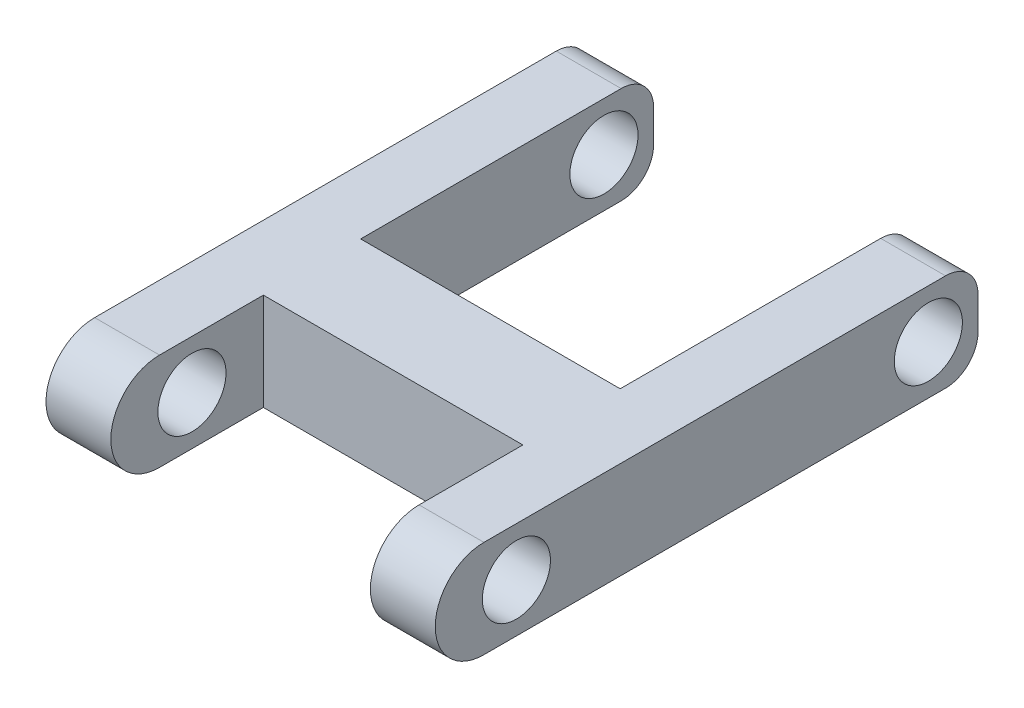
ISO-10303-21;
HEADER;
FILE_DESCRIPTION(('STEP AP214'),'2;1');
FILE_NAME('part.step','',(''),(''),'','','');
FILE_SCHEMA(('AUTOMOTIVE_DESIGN { 1 0 10303 214 1 1 1 1 }'));
ENDSEC;
DATA;
#1=APPLICATION_CONTEXT('core data for automotive mechanical design processes');
#2=APPLICATION_PROTOCOL_DEFINITION('international standard','automotive_design',2000,#1);
#3=PRODUCT_CONTEXT('',#1,'mechanical');
#4=PRODUCT('Part','Part','',(#3));
#5=PRODUCT_RELATED_PRODUCT_CATEGORY('part','',(#4));
#6=PRODUCT_DEFINITION_FORMATION('','',#4);
#7=PRODUCT_DEFINITION_CONTEXT('part definition',#1,'design');
#8=PRODUCT_DEFINITION('design','',#6,#7);
#9=PRODUCT_DEFINITION_SHAPE('','',#8);
#10=(LENGTH_UNIT() NAMED_UNIT(*) SI_UNIT(.MILLI.,.METRE.));
#11=(NAMED_UNIT(*) PLANE_ANGLE_UNIT() SI_UNIT($,.RADIAN.));
#12=(NAMED_UNIT(*) SI_UNIT($,.STERADIAN.) SOLID_ANGLE_UNIT());
#13=UNCERTAINTY_MEASURE_WITH_UNIT(LENGTH_MEASURE(1.E-05),#10,'distance_accuracy_value','');
#14=(GEOMETRIC_REPRESENTATION_CONTEXT(3) GLOBAL_UNCERTAINTY_ASSIGNED_CONTEXT((#13)) GLOBAL_UNIT_ASSIGNED_CONTEXT((#10,
#11,#12)) REPRESENTATION_CONTEXT('',''));
#15=CARTESIAN_POINT('',(0.,0.,0.));
#16=DIRECTION('',(0.,0.,1.));
#17=DIRECTION('',(1.,0.,0.));
#18=AXIS2_PLACEMENT_3D('',#15,#16,#17);
#19=CARTESIAN_POINT('',(-6.,1.5,-7.5));
#20=DIRECTION('',(1.,0.,0.));
#21=DIRECTION('',(0.,0.,-1.));
#22=AXIS2_PLACEMENT_3D('',#19,#20,#21);
#23=CYLINDRICAL_SURFACE('',#22,1.05);
#24=CARTESIAN_POINT('',(6.,1.5,-7.5));
#25=DIRECTION('',(1.,0.,0.));
#26=DIRECTION('',(0.,0.,-1.));
#27=AXIS2_PLACEMENT_3D('',#24,#25,#26);
#28=CIRCLE('',#27,1.05);
#29=CARTESIAN_POINT('',(6.,1.5,-8.55));
#30=VERTEX_POINT('',#29);
#31=EDGE_CURVE('E191',#30,#30,#28,.T.);
#32=ORIENTED_EDGE('',*,*,#31,.T.);
#33=EDGE_LOOP('',(#32));
#34=FACE_BOUND('',#33,.T.);
#35=CARTESIAN_POINT('',(4.,1.5,-7.5));
#36=DIRECTION('',(1.,0.,0.));
#37=DIRECTION('',(0.,0.,-1.));
#38=AXIS2_PLACEMENT_3D('',#35,#36,#37);
#39=CIRCLE('',#38,1.05);
#40=CARTESIAN_POINT('',(4.,1.5,-8.55));
#41=VERTEX_POINT('',#40);
#42=EDGE_CURVE('E257',#41,#41,#39,.F.);
#43=ORIENTED_EDGE('',*,*,#42,.T.);
#44=EDGE_LOOP('',(#43));
#45=FACE_BOUND('',#44,.T.);
#46=ADVANCED_FACE('F35',(#34,#45),#23,.F.);
#47=CARTESIAN_POINT('',(-4.,3.,8.7));
#48=DIRECTION('',(-1.,0.,0.));
#49=DIRECTION('',(0.,0.,1.));
#50=AXIS2_PLACEMENT_3D('',#47,#48,#49);
#51=PLANE('',#50);
#52=CARTESIAN_POINT('',(-4.,1.5,5.2));
#53=DIRECTION('',(-1.,0.,0.));
#54=DIRECTION('',(0.,0.,1.));
#55=AXIS2_PLACEMENT_3D('',#52,#53,#54);
#56=CIRCLE('',#55,1.05);
#57=CARTESIAN_POINT('',(-4.,1.5,6.25));
#58=VERTEX_POINT('',#57);
#59=EDGE_CURVE('E208',#58,#58,#56,.T.);
#60=ORIENTED_EDGE('',*,*,#59,.T.);
#61=EDGE_LOOP('',(#60));
#62=FACE_BOUND('',#61,.T.);
#63=CARTESIAN_POINT('',(-4.,1.5,6.2));
#64=DIRECTION('',(-1.,0.,0.));
#65=DIRECTION('',(0.,0.,1.));
#66=AXIS2_PLACEMENT_3D('',#63,#64,#65);
#67=CIRCLE('',#66,1.5);
#68=CARTESIAN_POINT('',(-4.,0.,6.2));
#69=VERTEX_POINT('',#68);
#70=CARTESIAN_POINT('',(-4.,3.,6.2));
#71=VERTEX_POINT('',#70);
#72=EDGE_CURVE('E224',#69,#71,#67,.T.);
#73=ORIENTED_EDGE('',*,*,#72,.F.);
#74=DIRECTION('',(0.,0.,-1.));
#75=VECTOR('',#74,1.);
#76=CARTESIAN_POINT('',(-4.,0.,8.7));
#77=LINE('',#76,#75);
#78=CARTESIAN_POINT('',(-4.,0.,3.));
#79=VERTEX_POINT('',#78);
#80=EDGE_CURVE('E226',#69,#79,#77,.T.);
#81=ORIENTED_EDGE('',*,*,#80,.T.);
#82=DIRECTION('',(0.,-1.,0.));
#83=VECTOR('',#82,1.);
#84=CARTESIAN_POINT('',(-4.,3.,3.));
#85=LINE('',#84,#83);
#86=CARTESIAN_POINT('',(-4.,3.,3.));
#87=VERTEX_POINT('',#86);
#88=EDGE_CURVE('E251',#87,#79,#85,.T.);
#89=ORIENTED_EDGE('',*,*,#88,.F.);
#90=DIRECTION('',(0.,0.,-1.));
#91=VECTOR('',#90,1.);
#92=CARTESIAN_POINT('',(-4.,3.,8.7));
#93=LINE('',#92,#91);
#94=EDGE_CURVE('E227',#71,#87,#93,.T.);
#95=ORIENTED_EDGE('',*,*,#94,.F.);
#96=EDGE_LOOP('',(#73,#81,#89,#95));
#97=FACE_BOUND('',#96,.T.);
#98=ADVANCED_FACE('F319',(#62,#97),#51,.F.);
#99=CARTESIAN_POINT('',(4.,3.,3.));
#100=DIRECTION('',(1.,0.,0.));
#101=DIRECTION('',(0.,0.,-1.));
#102=AXIS2_PLACEMENT_3D('',#99,#100,#101);
#103=PLANE('',#102);
#104=CARTESIAN_POINT('',(4.,1.5,5.2));
#105=DIRECTION('',(1.,0.,0.));
#106=DIRECTION('',(0.,0.,-1.));
#107=AXIS2_PLACEMENT_3D('',#104,#105,#106);
#108=CIRCLE('',#107,1.05);
#109=CARTESIAN_POINT('',(4.,1.5,4.15));
#110=VERTEX_POINT('',#109);
#111=EDGE_CURVE('E203',#110,#110,#108,.T.);
#112=ORIENTED_EDGE('',*,*,#111,.T.);
#113=EDGE_LOOP('',(#112));
#114=FACE_BOUND('',#113,.T.);
#115=CARTESIAN_POINT('',(4.,1.5,6.2));
#116=DIRECTION('',(1.,0.,0.));
#117=DIRECTION('',(0.,0.,-1.));
#118=AXIS2_PLACEMENT_3D('',#115,#116,#117);
#119=CIRCLE('',#118,1.5);
#120=CARTESIAN_POINT('',(4.,3.,6.2));
#121=VERTEX_POINT('',#120);
#122=CARTESIAN_POINT('',(4.,0.,6.2));
#123=VERTEX_POINT('',#122);
#124=EDGE_CURVE('E220',#121,#123,#119,.T.);
#125=ORIENTED_EDGE('',*,*,#124,.F.);
#126=DIRECTION('',(0.,0.,1.));
#127=VECTOR('',#126,1.);
#128=CARTESIAN_POINT('',(4.,3.,3.));
#129=LINE('',#128,#127);
#130=CARTESIAN_POINT('',(4.,3.,3.));
#131=VERTEX_POINT('',#130);
#132=EDGE_CURVE('E232',#131,#121,#129,.T.);
#133=ORIENTED_EDGE('',*,*,#132,.F.);
#134=DIRECTION('',(0.,-1.,0.));
#135=VECTOR('',#134,1.);
#136=CARTESIAN_POINT('',(4.,3.,3.));
#137=LINE('',#136,#135);
#138=CARTESIAN_POINT('',(4.,0.,3.));
#139=VERTEX_POINT('',#138);
#140=EDGE_CURVE('E239',#131,#139,#137,.T.);
#141=ORIENTED_EDGE('',*,*,#140,.T.);
#142=DIRECTION('',(0.,0.,1.));
#143=VECTOR('',#142,1.);
#144=CARTESIAN_POINT('',(4.,0.,3.));
#145=LINE('',#144,#143);
#146=EDGE_CURVE('E243',#139,#123,#145,.T.);
#147=ORIENTED_EDGE('',*,*,#146,.T.);
#148=EDGE_LOOP('',(#125,#133,#141,#147));
#149=FACE_BOUND('',#148,.T.);
#150=ADVANCED_FACE('F326',(#114,#149),#103,.F.);
#151=CARTESIAN_POINT('',(6.,3.,8.7));
#152=DIRECTION('',(-1.,0.,0.));
#153=DIRECTION('',(0.,0.,1.));
#154=AXIS2_PLACEMENT_3D('',#151,#152,#153);
#155=PLANE('',#154);
#156=CARTESIAN_POINT('',(6.,1.5,5.2));
#157=DIRECTION('',(-1.,0.,0.));
#158=DIRECTION('',(0.,0.,1.));
#159=AXIS2_PLACEMENT_3D('',#156,#157,#158);
#160=CIRCLE('',#159,1.05);
#161=CARTESIAN_POINT('',(6.,1.5,6.25));
#162=VERTEX_POINT('',#161);
#163=EDGE_CURVE('E200',#162,#162,#160,.T.);
#164=ORIENTED_EDGE('',*,*,#163,.T.);
#165=EDGE_LOOP('',(#164));
#166=FACE_BOUND('',#165,.T.);
#167=DIRECTION('',(0.,0.,-1.));
#168=VECTOR('',#167,1.);
#169=CARTESIAN_POINT('',(6.,0.,8.7));
#170=LINE('',#169,#168);
#171=CARTESIAN_POINT('',(6.00000000000001,0.,6.2));
#172=VERTEX_POINT('',#171);
#173=CARTESIAN_POINT('',(6.,0.,-8.03021981462437));
#174=VERTEX_POINT('',#173);
#175=EDGE_CURVE('E246',#172,#174,#170,.T.);
#176=ORIENTED_EDGE('',*,*,#175,.T.);
#177=CARTESIAN_POINT('',(6.,1.,-8.03021981462437));
#178=DIRECTION('',(-1.,0.,0.));
#179=DIRECTION('',(0.,0.,1.));
#180=AXIS2_PLACEMENT_3D('',#177,#178,#179);
#181=CIRCLE('',#180,1.);
#182=CARTESIAN_POINT('',(6.,1.,-9.03021981462437));
#183=VERTEX_POINT('',#182);
#184=EDGE_CURVE('E276',#174,#183,#181,.F.);
#185=ORIENTED_EDGE('',*,*,#184,.T.);
#186=DIRECTION('',(0.,-1.,0.));
#187=VECTOR('',#186,1.);
#188=CARTESIAN_POINT('',(6.,3.,-9.03021981462437));
#189=LINE('',#188,#187);
#190=CARTESIAN_POINT('',(6.,2.,-9.03021981462437));
#191=VERTEX_POINT('',#190);
#192=EDGE_CURVE('E178',#191,#183,#189,.T.);
#193=ORIENTED_EDGE('',*,*,#192,.F.);
#194=CARTESIAN_POINT('',(6.,2.,-8.03021981462437));
#195=DIRECTION('',(-1.,0.,0.));
#196=DIRECTION('',(0.,0.,1.));
#197=AXIS2_PLACEMENT_3D('',#194,#195,#196);
#198=CIRCLE('',#197,1.);
#199=CARTESIAN_POINT('',(6.,3.,-8.03021981462437));
#200=VERTEX_POINT('',#199);
#201=EDGE_CURVE('E278',#191,#200,#198,.F.);
#202=ORIENTED_EDGE('',*,*,#201,.T.);
#203=DIRECTION('',(0.,0.,-1.));
#204=VECTOR('',#203,1.);
#205=CARTESIAN_POINT('',(6.,3.,8.7));
#206=LINE('',#205,#204);
#207=CARTESIAN_POINT('',(6.00000000000001,3.,6.2));
#208=VERTEX_POINT('',#207);
#209=EDGE_CURVE('E235',#208,#200,#206,.T.);
#210=ORIENTED_EDGE('',*,*,#209,.F.);
#211=CARTESIAN_POINT('',(6.00000000000001,1.5,6.2));
#212=DIRECTION('',(-1.,0.,0.));
#213=DIRECTION('',(0.,0.,1.));
#214=AXIS2_PLACEMENT_3D('',#211,#212,#213);
#215=CIRCLE('',#214,1.5);
#216=EDGE_CURVE('E212',#172,#208,#215,.T.);
#217=ORIENTED_EDGE('',*,*,#216,.F.);
#218=EDGE_LOOP('',(#176,#185,#193,#202,#210,#217));
#219=FACE_BOUND('',#218,.T.);
#220=ORIENTED_EDGE('',*,*,#31,.F.);
#221=EDGE_LOOP('',(#220));
#222=FACE_BOUND('',#221,.T.);
#223=ADVANCED_FACE('F346',(#166,#219,#222),#155,.F.);
#224=CARTESIAN_POINT('',(-6.,3.,0.));
#225=DIRECTION('',(1.,0.,0.));
#226=DIRECTION('',(0.,0.,-1.));
#227=AXIS2_PLACEMENT_3D('',#224,#225,#226);
#228=PLANE('',#227);
#229=CARTESIAN_POINT('',(-6.,1.5,5.2));
#230=DIRECTION('',(-1.,0.,0.));
#231=DIRECTION('',(0.,0.,1.));
#232=AXIS2_PLACEMENT_3D('',#229,#230,#231);
#233=CIRCLE('',#232,1.05);
#234=CARTESIAN_POINT('',(-6.,1.5,6.25));
#235=VERTEX_POINT('',#234);
#236=EDGE_CURVE('E197',#235,#235,#233,.T.);
#237=ORIENTED_EDGE('',*,*,#236,.F.);
#238=EDGE_LOOP('',(#237));
#239=FACE_BOUND('',#238,.T.);
#240=CARTESIAN_POINT('',(-6.,1.5,6.2));
#241=DIRECTION('',(-1.,0.,0.));
#242=DIRECTION('',(0.,0.,1.));
#243=AXIS2_PLACEMENT_3D('',#240,#241,#242);
#244=CIRCLE('',#243,1.5);
#245=CARTESIAN_POINT('',(-6.,0.,6.2));
#246=VERTEX_POINT('',#245);
#247=CARTESIAN_POINT('',(-6.,3.,6.2));
#248=VERTEX_POINT('',#247);
#249=EDGE_CURVE('E211',#246,#248,#244,.T.);
#250=ORIENTED_EDGE('',*,*,#249,.T.);
#251=DIRECTION('',(0.,0.,1.));
#252=VECTOR('',#251,1.);
#253=CARTESIAN_POINT('',(-6.,3.,0.));
#254=LINE('',#253,#252);
#255=CARTESIAN_POINT('',(-6.,3.,-8.03021981462437));
#256=VERTEX_POINT('',#255);
#257=EDGE_CURVE('E237',#256,#248,#254,.T.);
#258=ORIENTED_EDGE('',*,*,#257,.F.);
#259=CARTESIAN_POINT('',(-6.,2.,-8.03021981462437));
#260=DIRECTION('',(1.,0.,0.));
#261=DIRECTION('',(0.,0.,-1.));
#262=AXIS2_PLACEMENT_3D('',#259,#260,#261);
#263=CIRCLE('',#262,1.);
#264=CARTESIAN_POINT('',(-6.,2.,-9.03021981462437));
#265=VERTEX_POINT('',#264);
#266=EDGE_CURVE('E289',#256,#265,#263,.F.);
#267=ORIENTED_EDGE('',*,*,#266,.T.);
#268=DIRECTION('',(0.,-1.,0.));
#269=VECTOR('',#268,1.);
#270=CARTESIAN_POINT('',(-6.,3.,-9.03021981462437));
#271=LINE('',#270,#269);
#272=CARTESIAN_POINT('',(-6.,1.,-9.03021981462437));
#273=VERTEX_POINT('',#272);
#274=EDGE_CURVE('E180',#265,#273,#271,.T.);
#275=ORIENTED_EDGE('',*,*,#274,.T.);
#276=CARTESIAN_POINT('',(-6.,1.,-8.03021981462437));
#277=DIRECTION('',(1.,0.,0.));
#278=DIRECTION('',(0.,0.,-1.));
#279=AXIS2_PLACEMENT_3D('',#276,#277,#278);
#280=CIRCLE('',#279,1.);
#281=CARTESIAN_POINT('',(-6.,0.,-8.03021981462437));
#282=VERTEX_POINT('',#281);
#283=EDGE_CURVE('E286',#273,#282,#280,.F.);
#284=ORIENTED_EDGE('',*,*,#283,.T.);
#285=DIRECTION('',(0.,0.,1.));
#286=VECTOR('',#285,1.);
#287=CARTESIAN_POINT('',(-6.,0.,0.));
#288=LINE('',#287,#286);
#289=EDGE_CURVE('E230',#282,#246,#288,.T.);
#290=ORIENTED_EDGE('',*,*,#289,.T.);
#291=EDGE_LOOP('',(#250,#258,#267,#275,#284,#290));
#292=FACE_BOUND('',#291,.T.);
#293=CARTESIAN_POINT('',(-6.,1.5,-7.5));
#294=DIRECTION('',(1.,0.,0.));
#295=DIRECTION('',(0.,0.,-1.));
#296=AXIS2_PLACEMENT_3D('',#293,#294,#295);
#297=CIRCLE('',#296,1.05);
#298=CARTESIAN_POINT('',(-6.,1.5,-8.55));
#299=VERTEX_POINT('',#298);
#300=EDGE_CURVE('E194',#299,#299,#297,.T.);
#301=ORIENTED_EDGE('',*,*,#300,.T.);
#302=EDGE_LOOP('',(#301));
#303=FACE_BOUND('',#302,.T.);
#304=ADVANCED_FACE('F298',(#239,#292,#303),#228,.F.);
#305=CARTESIAN_POINT('',(0.,3.,0.));
#306=DIRECTION('',(0.,-1.,0.));
#307=DIRECTION('',(0.,0.,-1.));
#308=AXIS2_PLACEMENT_3D('',#305,#306,#307);
#309=PLANE('',#308);
#310=DIRECTION('',(0.,0.,-1.));
#311=VECTOR('',#310,1.);
#312=CARTESIAN_POINT('',(4.,3.,-8.));
#313=LINE('',#312,#311);
#314=CARTESIAN_POINT('',(4.,3.,0.));
#315=VERTEX_POINT('',#314);
#316=CARTESIAN_POINT('',(4.,3.,-8.03021981462437));
#317=VERTEX_POINT('',#316);
#318=EDGE_CURVE('E148',#315,#317,#313,.T.);
#319=ORIENTED_EDGE('',*,*,#318,.F.);
#320=DIRECTION('',(-1.,0.,0.));
#321=VECTOR('',#320,1.);
#322=CARTESIAN_POINT('',(4.,3.,0.));
#323=LINE('',#322,#321);
#324=CARTESIAN_POINT('',(-4.,3.,0.));
#325=VERTEX_POINT('',#324);
#326=EDGE_CURVE('E153',#315,#325,#323,.T.);
#327=ORIENTED_EDGE('',*,*,#326,.T.);
#328=DIRECTION('',(0.,0.,1.));
#329=VECTOR('',#328,1.);
#330=CARTESIAN_POINT('',(-4.,3.,-12.));
#331=LINE('',#330,#329);
#332=CARTESIAN_POINT('',(-4.,3.,-8.03021981462437));
#333=VERTEX_POINT('',#332);
#334=EDGE_CURVE('E158',#333,#325,#331,.T.);
#335=ORIENTED_EDGE('',*,*,#334,.F.);
#336=DIRECTION('',(-1.,0.,0.));
#337=VECTOR('',#336,1.);
#338=CARTESIAN_POINT('',(0.,3.,-8.03021981462437));
#339=LINE('',#338,#337);
#340=EDGE_CURVE('E263',#333,#256,#339,.T.);
#341=ORIENTED_EDGE('',*,*,#340,.T.);
#342=ORIENTED_EDGE('',*,*,#257,.T.);
#343=DIRECTION('',(-1.,0.,0.));
#344=VECTOR('',#343,1.);
#345=CARTESIAN_POINT('',(6.00000000000001,3.,6.2));
#346=LINE('',#345,#344);
#347=EDGE_CURVE('E214',#71,#248,#346,.T.);
#348=ORIENTED_EDGE('',*,*,#347,.F.);
#349=ORIENTED_EDGE('',*,*,#94,.T.);
#350=DIRECTION('',(1.,0.,0.));
#351=VECTOR('',#350,1.);
#352=CARTESIAN_POINT('',(-4.,3.,3.));
#353=LINE('',#352,#351);
#354=EDGE_CURVE('E229',#87,#131,#353,.T.);
#355=ORIENTED_EDGE('',*,*,#354,.T.);
#356=ORIENTED_EDGE('',*,*,#132,.T.);
#357=EDGE_CURVE('E221',#208,#121,#346,.T.);
#358=ORIENTED_EDGE('',*,*,#357,.F.);
#359=ORIENTED_EDGE('',*,*,#209,.T.);
#360=DIRECTION('',(-1.,0.,0.));
#361=VECTOR('',#360,1.);
#362=CARTESIAN_POINT('',(0.,3.,-8.03021981462437));
#363=LINE('',#362,#361);
#364=EDGE_CURVE('E155',#200,#317,#363,.T.);
#365=ORIENTED_EDGE('',*,*,#364,.T.);
#366=EDGE_LOOP('',(#319,#327,#335,#341,#342,#348,#349,#355,#356,#358,#359,#365));
#367=FACE_BOUND('',#366,.T.);
#368=ADVANCED_FACE('F150',(#367),#309,.F.);
#369=CARTESIAN_POINT('',(0.,0.,0.));
#370=DIRECTION('',(0.,-1.,0.));
#371=DIRECTION('',(0.,0.,-1.));
#372=AXIS2_PLACEMENT_3D('',#369,#370,#371);
#373=PLANE('',#372);
#374=DIRECTION('',(-1.,0.,0.));
#375=VECTOR('',#374,1.);
#376=CARTESIAN_POINT('',(4.,0.,0.));
#377=LINE('',#376,#375);
#378=CARTESIAN_POINT('',(4.,0.,0.));
#379=VERTEX_POINT('',#378);
#380=CARTESIAN_POINT('',(-4.,0.,0.));
#381=VERTEX_POINT('',#380);
#382=EDGE_CURVE('E174',#379,#381,#377,.T.);
#383=ORIENTED_EDGE('',*,*,#382,.F.);
#384=DIRECTION('',(0.,0.,-1.));
#385=VECTOR('',#384,1.);
#386=CARTESIAN_POINT('',(4.,0.,-8.));
#387=LINE('',#386,#385);
#388=CARTESIAN_POINT('',(4.,0.,-8.03021981462437));
#389=VERTEX_POINT('',#388);
#390=EDGE_CURVE('E165',#379,#389,#387,.T.);
#391=ORIENTED_EDGE('',*,*,#390,.T.);
#392=DIRECTION('',(-1.,0.,0.));
#393=VECTOR('',#392,1.);
#394=CARTESIAN_POINT('',(6.,0.,-8.03021981462437));
#395=LINE('',#394,#393);
#396=EDGE_CURVE('E283',#389,#174,#395,.F.);
#397=ORIENTED_EDGE('',*,*,#396,.T.);
#398=ORIENTED_EDGE('',*,*,#175,.F.);
#399=DIRECTION('',(-1.,0.,0.));
#400=VECTOR('',#399,1.);
#401=CARTESIAN_POINT('',(6.00000000000001,0.,6.2));
#402=LINE('',#401,#400);
#403=EDGE_CURVE('E217',#172,#123,#402,.T.);
#404=ORIENTED_EDGE('',*,*,#403,.T.);
#405=ORIENTED_EDGE('',*,*,#146,.F.);
#406=DIRECTION('',(1.,0.,0.));
#407=VECTOR('',#406,1.);
#408=CARTESIAN_POINT('',(-4.,0.,3.));
#409=LINE('',#408,#407);
#410=EDGE_CURVE('E241',#79,#139,#409,.T.);
#411=ORIENTED_EDGE('',*,*,#410,.F.);
#412=ORIENTED_EDGE('',*,*,#80,.F.);
#413=DIRECTION('',(-1.,0.,0.));
#414=VECTOR('',#413,1.);
#415=CARTESIAN_POINT('',(6.00000000000001,0.,6.2));
#416=LINE('',#415,#414);
#417=EDGE_CURVE('E254',#69,#246,#416,.T.);
#418=ORIENTED_EDGE('',*,*,#417,.T.);
#419=ORIENTED_EDGE('',*,*,#289,.F.);
#420=DIRECTION('',(-1.,0.,0.));
#421=VECTOR('',#420,1.);
#422=CARTESIAN_POINT('',(-4.,0.,-8.03021981462437));
#423=LINE('',#422,#421);
#424=CARTESIAN_POINT('',(-4.,0.,-8.03021981462437));
#425=VERTEX_POINT('',#424);
#426=EDGE_CURVE('E281',#282,#425,#423,.F.);
#427=ORIENTED_EDGE('',*,*,#426,.T.);
#428=DIRECTION('',(0.,0.,1.));
#429=VECTOR('',#428,1.);
#430=CARTESIAN_POINT('',(-4.,0.,-12.));
#431=LINE('',#430,#429);
#432=EDGE_CURVE('E190',#425,#381,#431,.T.);
#433=ORIENTED_EDGE('',*,*,#432,.T.);
#434=EDGE_LOOP('',(#383,#391,#397,#398,#404,#405,#411,#412,#418,#419,#427,#433));
#435=FACE_BOUND('',#434,.T.);
#436=ADVANCED_FACE('F310',(#435),#373,.T.);
#437=CARTESIAN_POINT('',(-4.,3.,3.));
#438=DIRECTION('',(0.,0.,-1.));
#439=DIRECTION('',(-1.,0.,0.));
#440=AXIS2_PLACEMENT_3D('',#437,#438,#439);
#441=PLANE('',#440);
#442=ORIENTED_EDGE('',*,*,#410,.T.);
#443=ORIENTED_EDGE('',*,*,#140,.F.);
#444=ORIENTED_EDGE('',*,*,#354,.F.);
#445=ORIENTED_EDGE('',*,*,#88,.T.);
#446=EDGE_LOOP('',(#442,#443,#444,#445));
#447=FACE_BOUND('',#446,.T.);
#448=ADVANCED_FACE('F362',(#447),#441,.F.);
#449=CARTESIAN_POINT('',(6.00000000000001,1.5,6.2));
#450=DIRECTION('',(-1.,0.,0.));
#451=DIRECTION('',(0.,0.,1.));
#452=AXIS2_PLACEMENT_3D('',#449,#450,#451);
#453=CYLINDRICAL_SURFACE('',#452,1.5);
#454=ORIENTED_EDGE('',*,*,#72,.T.);
#455=ORIENTED_EDGE('',*,*,#347,.T.);
#456=ORIENTED_EDGE('',*,*,#249,.F.);
#457=ORIENTED_EDGE('',*,*,#417,.F.);
#458=EDGE_LOOP('',(#454,#455,#456,#457));
#459=FACE_BOUND('',#458,.T.);
#460=ADVANCED_FACE('F364',(#459),#453,.T.);
#461=ORIENTED_EDGE('',*,*,#124,.T.);
#462=ORIENTED_EDGE('',*,*,#403,.F.);
#463=ORIENTED_EDGE('',*,*,#216,.T.);
#464=ORIENTED_EDGE('',*,*,#357,.T.);
#465=EDGE_LOOP('',(#461,#462,#463,#464));
#466=FACE_BOUND('',#465,.T.);
#467=ADVANCED_FACE('F393',(#466),#453,.T.);
#468=CARTESIAN_POINT('',(6.,1.5,5.2));
#469=DIRECTION('',(-1.,0.,0.));
#470=DIRECTION('',(0.,0.,1.));
#471=AXIS2_PLACEMENT_3D('',#468,#469,#470);
#472=CYLINDRICAL_SURFACE('',#471,1.05);
#473=ORIENTED_EDGE('',*,*,#236,.T.);
#474=EDGE_LOOP('',(#473));
#475=FACE_BOUND('',#474,.T.);
#476=ORIENTED_EDGE('',*,*,#59,.F.);
#477=EDGE_LOOP('',(#476));
#478=FACE_BOUND('',#477,.T.);
#479=ADVANCED_FACE('F340',(#475,#478),#472,.F.);
#480=ORIENTED_EDGE('',*,*,#163,.F.);
#481=EDGE_LOOP('',(#480));
#482=FACE_BOUND('',#481,.T.);
#483=ORIENTED_EDGE('',*,*,#111,.F.);
#484=EDGE_LOOP('',(#483));
#485=FACE_BOUND('',#484,.T.);
#486=ADVANCED_FACE('F333',(#482,#485),#472,.F.);
#487=CARTESIAN_POINT('',(-4.,1.5,-7.5));
#488=DIRECTION('',(-1.,0.,0.));
#489=DIRECTION('',(0.,0.,1.));
#490=AXIS2_PLACEMENT_3D('',#487,#488,#489);
#491=CIRCLE('',#490,1.05);
#492=CARTESIAN_POINT('',(-4.,1.5,-6.45));
#493=VERTEX_POINT('',#492);
#494=EDGE_CURVE('E260',#493,#493,#491,.F.);
#495=ORIENTED_EDGE('',*,*,#494,.T.);
#496=EDGE_LOOP('',(#495));
#497=FACE_BOUND('',#496,.T.);
#498=ORIENTED_EDGE('',*,*,#300,.F.);
#499=EDGE_LOOP('',(#498));
#500=FACE_BOUND('',#499,.T.);
#501=ADVANCED_FACE('F322',(#497,#500),#23,.F.);
#502=CARTESIAN_POINT('',(4.,0.,-8.));
#503=DIRECTION('',(1.,0.,0.));
#504=DIRECTION('',(0.,0.,-1.));
#505=AXIS2_PLACEMENT_3D('',#502,#503,#504);
#506=PLANE('',#505);
#507=ORIENTED_EDGE('',*,*,#42,.F.);
#508=EDGE_LOOP('',(#507));
#509=FACE_BOUND('',#508,.T.);
#510=CARTESIAN_POINT('',(4.,1.,-8.03021981462437));
#511=DIRECTION('',(1.,0.,0.));
#512=DIRECTION('',(0.,0.,-1.));
#513=AXIS2_PLACEMENT_3D('',#510,#511,#512);
#514=CIRCLE('',#513,1.);
#515=CARTESIAN_POINT('',(4.,1.,-9.03021981462437));
#516=VERTEX_POINT('',#515);
#517=EDGE_CURVE('E267',#516,#389,#514,.F.);
#518=ORIENTED_EDGE('',*,*,#517,.T.);
#519=ORIENTED_EDGE('',*,*,#390,.F.);
#520=DIRECTION('',(0.,-1.,0.));
#521=VECTOR('',#520,1.);
#522=CARTESIAN_POINT('',(4.,3.,0.));
#523=LINE('',#522,#521);
#524=EDGE_CURVE('E162',#315,#379,#523,.T.);
#525=ORIENTED_EDGE('',*,*,#524,.F.);
#526=ORIENTED_EDGE('',*,*,#318,.T.);
#527=CARTESIAN_POINT('',(4.,2.,-8.03021981462437));
#528=DIRECTION('',(1.,0.,0.));
#529=DIRECTION('',(0.,0.,-1.));
#530=AXIS2_PLACEMENT_3D('',#527,#528,#529);
#531=CIRCLE('',#530,1.);
#532=CARTESIAN_POINT('',(4.,2.,-9.03021981462437));
#533=VERTEX_POINT('',#532);
#534=EDGE_CURVE('E269',#317,#533,#531,.F.);
#535=ORIENTED_EDGE('',*,*,#534,.T.);
#536=DIRECTION('',(0.,-1.,0.));
#537=VECTOR('',#536,1.);
#538=CARTESIAN_POINT('',(4.,0.,-9.03021981462437));
#539=LINE('',#538,#537);
#540=EDGE_CURVE('E159',#533,#516,#539,.T.);
#541=ORIENTED_EDGE('',*,*,#540,.T.);
#542=EDGE_LOOP('',(#518,#519,#525,#526,#535,#541));
#543=FACE_BOUND('',#542,.T.);
#544=ADVANCED_FACE('F164',(#509,#543),#506,.F.);
#545=CARTESIAN_POINT('',(-4.,0.,-12.));
#546=DIRECTION('',(-1.,0.,0.));
#547=DIRECTION('',(0.,0.,1.));
#548=AXIS2_PLACEMENT_3D('',#545,#546,#547);
#549=PLANE('',#548);
#550=ORIENTED_EDGE('',*,*,#494,.F.);
#551=EDGE_LOOP('',(#550));
#552=FACE_BOUND('',#551,.T.);
#553=ORIENTED_EDGE('',*,*,#334,.T.);
#554=DIRECTION('',(0.,-1.,0.));
#555=VECTOR('',#554,1.);
#556=CARTESIAN_POINT('',(-4.,3.,0.));
#557=LINE('',#556,#555);
#558=EDGE_CURVE('E169',#325,#381,#557,.T.);
#559=ORIENTED_EDGE('',*,*,#558,.T.);
#560=ORIENTED_EDGE('',*,*,#432,.F.);
#561=CARTESIAN_POINT('',(-4.,1.,-8.03021981462437));
#562=DIRECTION('',(-1.,0.,0.));
#563=DIRECTION('',(0.,0.,1.));
#564=AXIS2_PLACEMENT_3D('',#561,#562,#563);
#565=CIRCLE('',#564,1.);
#566=CARTESIAN_POINT('',(-4.,1.,-9.03021981462437));
#567=VERTEX_POINT('',#566);
#568=EDGE_CURVE('E43',#425,#567,#565,.F.);
#569=ORIENTED_EDGE('',*,*,#568,.T.);
#570=DIRECTION('',(0.,1.,0.));
#571=VECTOR('',#570,1.);
#572=CARTESIAN_POINT('',(-4.,0.,-9.03021981462437));
#573=LINE('',#572,#571);
#574=CARTESIAN_POINT('',(-4.,2.,-9.03021981462437));
#575=VERTEX_POINT('',#574);
#576=EDGE_CURVE('E183',#567,#575,#573,.T.);
#577=ORIENTED_EDGE('',*,*,#576,.T.);
#578=CARTESIAN_POINT('',(-4.,2.,-8.03021981462437));
#579=DIRECTION('',(-1.,0.,0.));
#580=DIRECTION('',(0.,0.,1.));
#581=AXIS2_PLACEMENT_3D('',#578,#579,#580);
#582=CIRCLE('',#581,1.);
#583=EDGE_CURVE('E12',#575,#333,#582,.F.);
#584=ORIENTED_EDGE('',*,*,#583,.T.);
#585=EDGE_LOOP('',(#553,#559,#560,#569,#577,#584));
#586=FACE_BOUND('',#585,.T.);
#587=ADVANCED_FACE('F308',(#552,#586),#549,.F.);
#588=CARTESIAN_POINT('',(-6.,3.,-9.03021981462437));
#589=DIRECTION('',(0.,0.,1.));
#590=DIRECTION('',(1.,0.,0.));
#591=AXIS2_PLACEMENT_3D('',#588,#589,#590);
#592=PLANE('',#591);
#593=ORIENTED_EDGE('',*,*,#274,.F.);
#594=DIRECTION('',(-1.,0.,0.));
#595=VECTOR('',#594,1.);
#596=CARTESIAN_POINT('',(-6.,2.,-9.03021981462437));
#597=LINE('',#596,#595);
#598=EDGE_CURVE('E50',#265,#575,#597,.F.);
#599=ORIENTED_EDGE('',*,*,#598,.T.);
#600=ORIENTED_EDGE('',*,*,#576,.F.);
#601=DIRECTION('',(-1.,0.,0.));
#602=VECTOR('',#601,1.);
#603=CARTESIAN_POINT('',(-6.,1.,-9.03021981462437));
#604=LINE('',#603,#602);
#605=EDGE_CURVE('E291',#567,#273,#604,.T.);
#606=ORIENTED_EDGE('',*,*,#605,.T.);
#607=EDGE_LOOP('',(#593,#599,#600,#606));
#608=FACE_BOUND('',#607,.T.);
#609=ADVANCED_FACE('F295',(#608),#592,.F.);
#610=ORIENTED_EDGE('',*,*,#540,.F.);
#611=DIRECTION('',(-1.,0.,0.));
#612=VECTOR('',#611,1.);
#613=CARTESIAN_POINT('',(-6.,2.,-9.03021981462437));
#614=LINE('',#613,#612);
#615=EDGE_CURVE('E274',#533,#191,#614,.F.);
#616=ORIENTED_EDGE('',*,*,#615,.T.);
#617=ORIENTED_EDGE('',*,*,#192,.T.);
#618=DIRECTION('',(-1.,0.,0.));
#619=VECTOR('',#618,1.);
#620=CARTESIAN_POINT('',(4.,1.,-9.03021981462437));
#621=LINE('',#620,#619);
#622=EDGE_CURVE('E271',#183,#516,#621,.T.);
#623=ORIENTED_EDGE('',*,*,#622,.T.);
#624=EDGE_LOOP('',(#610,#616,#617,#623));
#625=FACE_BOUND('',#624,.T.);
#626=ADVANCED_FACE('F370',(#625),#592,.F.);
#627=CARTESIAN_POINT('',(0.,2.,-8.03021981462437));
#628=DIRECTION('',(-1.,0.,0.));
#629=DIRECTION('',(0.,0.,1.));
#630=AXIS2_PLACEMENT_3D('',#627,#628,#629);
#631=CYLINDRICAL_SURFACE('',#630,1.);
#632=ORIENTED_EDGE('',*,*,#201,.F.);
#633=ORIENTED_EDGE('',*,*,#615,.F.);
#634=ORIENTED_EDGE('',*,*,#534,.F.);
#635=ORIENTED_EDGE('',*,*,#364,.F.);
#636=EDGE_LOOP('',(#632,#633,#634,#635));
#637=FACE_BOUND('',#636,.T.);
#638=ADVANCED_FACE('F367',(#637),#631,.T.);
#639=CARTESIAN_POINT('',(-6.,1.,-8.03021981462437));
#640=DIRECTION('',(1.,0.,0.));
#641=DIRECTION('',(0.,0.,-1.));
#642=AXIS2_PLACEMENT_3D('',#639,#640,#641);
#643=CYLINDRICAL_SURFACE('',#642,1.);
#644=ORIENTED_EDGE('',*,*,#184,.F.);
#645=ORIENTED_EDGE('',*,*,#396,.F.);
#646=ORIENTED_EDGE('',*,*,#517,.F.);
#647=ORIENTED_EDGE('',*,*,#622,.F.);
#648=EDGE_LOOP('',(#644,#645,#646,#647));
#649=FACE_BOUND('',#648,.T.);
#650=ADVANCED_FACE('F317',(#649),#643,.T.);
#651=CARTESIAN_POINT('',(0.,2.,-8.03021981462437));
#652=DIRECTION('',(-1.,0.,0.));
#653=DIRECTION('',(0.,0.,1.));
#654=AXIS2_PLACEMENT_3D('',#651,#652,#653);
#655=CYLINDRICAL_SURFACE('',#654,1.);
#656=ORIENTED_EDGE('',*,*,#583,.F.);
#657=ORIENTED_EDGE('',*,*,#598,.F.);
#658=ORIENTED_EDGE('',*,*,#266,.F.);
#659=ORIENTED_EDGE('',*,*,#340,.F.);
#660=EDGE_LOOP('',(#656,#657,#658,#659));
#661=FACE_BOUND('',#660,.T.);
#662=ADVANCED_FACE('F305',(#661),#655,.T.);
#663=CARTESIAN_POINT('',(-6.,1.,-8.03021981462437));
#664=DIRECTION('',(1.,0.,0.));
#665=DIRECTION('',(0.,0.,-1.));
#666=AXIS2_PLACEMENT_3D('',#663,#664,#665);
#667=CYLINDRICAL_SURFACE('',#666,1.);
#668=ORIENTED_EDGE('',*,*,#568,.F.);
#669=ORIENTED_EDGE('',*,*,#426,.F.);
#670=ORIENTED_EDGE('',*,*,#283,.F.);
#671=ORIENTED_EDGE('',*,*,#605,.F.);
#672=EDGE_LOOP('',(#668,#669,#670,#671));
#673=FACE_BOUND('',#672,.T.);
#674=ADVANCED_FACE('F37',(#673),#667,.T.);
#675=CARTESIAN_POINT('',(4.,3.,0.));
#676=DIRECTION('',(0.,0.,1.));
#677=DIRECTION('',(1.,0.,0.));
#678=AXIS2_PLACEMENT_3D('',#675,#676,#677);
#679=PLANE('',#678);
#680=ORIENTED_EDGE('',*,*,#382,.T.);
#681=ORIENTED_EDGE('',*,*,#558,.F.);
#682=ORIENTED_EDGE('',*,*,#326,.F.);
#683=ORIENTED_EDGE('',*,*,#524,.T.);
#684=EDGE_LOOP('',(#680,#681,#682,#683));
#685=FACE_BOUND('',#684,.T.);
#686=ADVANCED_FACE('F172',(#685),#679,.F.);
#687=CLOSED_SHELL('',(#46,#98,#150,#223,#304,#368,#436,#448,#460,#467,#479,#486,#501,#544,#587,
#609,#626,#638,#650,#662,#674,#686));
#688=MANIFOLD_SOLID_BREP('B2',#687);
#689=ADVANCED_BREP_SHAPE_REPRESENTATION('',(#18,#688),#14);
#690=SHAPE_DEFINITION_REPRESENTATION(#9,#689);
ENDSEC;
END-ISO-10303-21;
